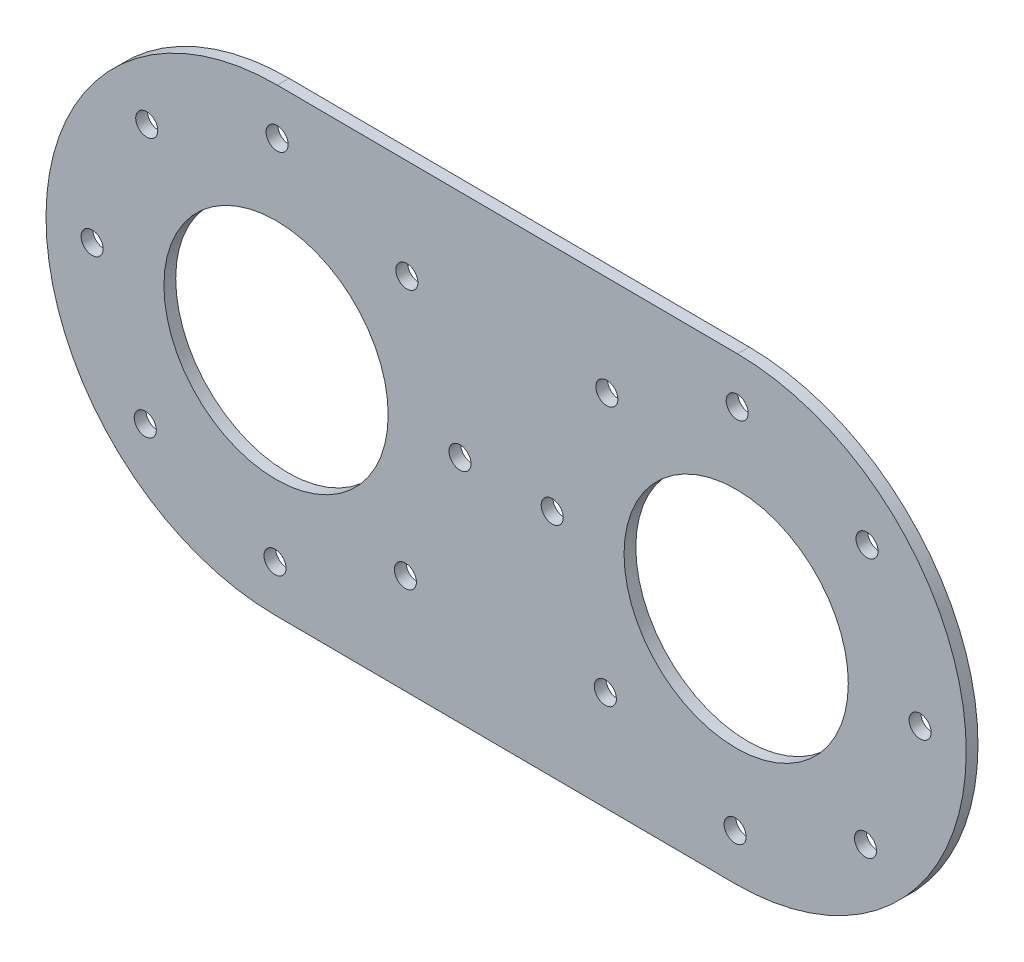
ISO-10303-21;
HEADER;
FILE_DESCRIPTION(('STEP AP214'),'2;1');
FILE_NAME('part.step','',(''),(''),'','','');
FILE_SCHEMA(('AUTOMOTIVE_DESIGN { 1 0 10303 214 1 1 1 1 }'));
ENDSEC;
DATA;
#1=APPLICATION_CONTEXT('core data for automotive mechanical design processes');
#2=APPLICATION_PROTOCOL_DEFINITION('international standard','automotive_design',2000,#1);
#3=PRODUCT_CONTEXT('',#1,'mechanical');
#4=PRODUCT('Part','Part','',(#3));
#5=PRODUCT_RELATED_PRODUCT_CATEGORY('part','',(#4));
#6=PRODUCT_DEFINITION_FORMATION('','',#4);
#7=PRODUCT_DEFINITION_CONTEXT('part definition',#1,'design');
#8=PRODUCT_DEFINITION('design','',#6,#7);
#9=PRODUCT_DEFINITION_SHAPE('','',#8);
#10=(LENGTH_UNIT() NAMED_UNIT(*) SI_UNIT(.MILLI.,.METRE.));
#11=(NAMED_UNIT(*) PLANE_ANGLE_UNIT() SI_UNIT($,.RADIAN.));
#12=(NAMED_UNIT(*) SI_UNIT($,.STERADIAN.) SOLID_ANGLE_UNIT());
#13=UNCERTAINTY_MEASURE_WITH_UNIT(LENGTH_MEASURE(1.E-05),#10,'distance_accuracy_value','');
#14=(GEOMETRIC_REPRESENTATION_CONTEXT(3) GLOBAL_UNCERTAINTY_ASSIGNED_CONTEXT((#13)) GLOBAL_UNIT_ASSIGNED_CONTEXT((#10,
#11,#12)) REPRESENTATION_CONTEXT('',''));
#15=CARTESIAN_POINT('',(0.,0.,0.));
#16=DIRECTION('',(0.,0.,1.));
#17=DIRECTION('',(1.,0.,0.));
#18=AXIS2_PLACEMENT_3D('',#15,#16,#17);
#19=CARTESIAN_POINT('',(0.0687496875803491,12.1384849747998,0.8));
#20=DIRECTION('',(0.00566368744206134,0.999983961193658,0.));
#21=DIRECTION('',(-0.999983961193658,0.00566368744206134,0.));
#22=AXIS2_PLACEMENT_3D('',#19,#20,#21);
#23=PLANE('',#22);
#24=DIRECTION('',(0.999983961193658,-0.00566368744206134,0.));
#25=VECTOR('',#24,1.);
#26=CARTESIAN_POINT('',(0.0687496875803491,12.1384849747998,0.));
#27=LINE('',#26,#25);
#28=CARTESIAN_POINT('',(0.0885443903629552,12.1383728619921,0.));
#29=VERTEX_POINT('',#28);
#30=CARTESIAN_POINT('',(31.3554397078373,11.9612840993379,0.));
#31=VERTEX_POINT('',#30);
#32=EDGE_CURVE('E160',#29,#31,#27,.T.);
#33=ORIENTED_EDGE('',*,*,#32,.F.);
#34=DIRECTION('',(0.,0.,-1.));
#35=VECTOR('',#34,1.);
#36=CARTESIAN_POINT('',(0.0885443903629552,12.1383728619921,0.8));
#37=LINE('',#36,#35);
#38=CARTESIAN_POINT('',(0.0885443903629552,12.1383728619921,0.8));
#39=VERTEX_POINT('',#38);
#40=EDGE_CURVE('E11',#39,#29,#37,.T.);
#41=ORIENTED_EDGE('',*,*,#40,.F.);
#42=DIRECTION('',(0.999983961193658,-0.00566368744206134,0.));
#43=VECTOR('',#42,1.);
#44=CARTESIAN_POINT('',(0.0687496875803491,12.1384849747998,0.8));
#45=LINE('',#44,#43);
#46=CARTESIAN_POINT('',(31.3554397078373,11.9612840993379,0.8));
#47=VERTEX_POINT('',#46);
#48=EDGE_CURVE('E94',#39,#47,#45,.T.);
#49=ORIENTED_EDGE('',*,*,#48,.T.);
#50=DIRECTION('',(0.,0.,-1.));
#51=VECTOR('',#50,1.);
#52=CARTESIAN_POINT('',(31.3554397078373,11.9612840993379,0.8));
#53=LINE('',#52,#51);
#54=EDGE_CURVE('E75',#47,#31,#53,.T.);
#55=ORIENTED_EDGE('',*,*,#54,.T.);
#56=EDGE_LOOP('',(#33,#41,#49,#55));
#57=FACE_BOUND('',#56,.T.);
#58=ADVANCED_FACE('F36',(#57),#23,.T.);
#59=CARTESIAN_POINT('',(0.,-3.4950763921212,0.8));
#60=DIRECTION('',(0.,0.,-1.));
#61=DIRECTION('',(-1.,0.,0.));
#62=AXIS2_PLACEMENT_3D('',#59,#60,#61);
#63=CYLINDRICAL_SURFACE('',#62,15.6337);
#64=CARTESIAN_POINT('',(0.,-3.4950763921212,0.));
#65=DIRECTION('',(0.,0.,1.));
#66=DIRECTION('',(1.,0.,0.));
#67=AXIS2_PLACEMENT_3D('',#64,#65,#66);
#68=CIRCLE('',#67,15.6337);
#69=CARTESIAN_POINT('',(-0.0885443903629465,-19.1285256462345,0.));
#70=VERTEX_POINT('',#69);
#71=EDGE_CURVE('E99',#29,#70,#68,.T.);
#72=ORIENTED_EDGE('',*,*,#71,.T.);
#73=DIRECTION('',(0.,0.,-1.));
#74=VECTOR('',#73,1.);
#75=CARTESIAN_POINT('',(-0.0885443903629465,-19.1285256462345,0.8));
#76=LINE('',#75,#74);
#77=CARTESIAN_POINT('',(-0.0885443903629465,-19.1285256462345,0.8));
#78=VERTEX_POINT('',#77);
#79=EDGE_CURVE('E45',#78,#70,#76,.T.);
#80=ORIENTED_EDGE('',*,*,#79,.F.);
#81=CARTESIAN_POINT('',(0.,-3.4950763921212,0.8));
#82=DIRECTION('',(0.,0.,1.));
#83=DIRECTION('',(1.,0.,0.));
#84=AXIS2_PLACEMENT_3D('',#81,#82,#83);
#85=CIRCLE('',#84,15.6337);
#86=EDGE_CURVE('E90',#39,#78,#85,.T.);
#87=ORIENTED_EDGE('',*,*,#86,.F.);
#88=ORIENTED_EDGE('',*,*,#40,.T.);
#89=EDGE_LOOP('',(#72,#80,#87,#88));
#90=FACE_BOUND('',#89,.T.);
#91=ADVANCED_FACE('F97',(#90),#63,.T.);
#92=CARTESIAN_POINT('',(-0.108339093145551,-19.1284135334268,0.8));
#93=DIRECTION('',(0.00566368744206089,0.999983961193658,0.));
#94=DIRECTION('',(-0.999983961193658,0.00566368744206089,0.));
#95=AXIS2_PLACEMENT_3D('',#92,#93,#94);
#96=PLANE('',#95);
#97=DIRECTION('',(0.999983961193658,-0.00566368744206089,0.));
#98=VECTOR('',#97,1.);
#99=CARTESIAN_POINT('',(-0.108339093145551,-19.1284135334268,0.));
#100=LINE('',#99,#98);
#101=CARTESIAN_POINT('',(31.1783509271114,-19.3056144088887,0.));
#102=VERTEX_POINT('',#101);
#103=EDGE_CURVE('E157',#70,#102,#100,.T.);
#104=ORIENTED_EDGE('',*,*,#103,.T.);
#105=DIRECTION('',(0.,0.,-1.));
#106=VECTOR('',#105,1.);
#107=CARTESIAN_POINT('',(31.1783509271114,-19.3056144088887,0.8));
#108=LINE('',#107,#106);
#109=CARTESIAN_POINT('',(31.1783509271114,-19.3056144088887,0.8));
#110=VERTEX_POINT('',#109);
#111=EDGE_CURVE('E89',#110,#102,#108,.T.);
#112=ORIENTED_EDGE('',*,*,#111,.F.);
#113=DIRECTION('',(0.999983961193658,-0.00566368744206089,0.));
#114=VECTOR('',#113,1.);
#115=CARTESIAN_POINT('',(-0.108339093145551,-19.1284135334268,0.8));
#116=LINE('',#115,#114);
#117=EDGE_CURVE('E83',#78,#110,#116,.T.);
#118=ORIENTED_EDGE('',*,*,#117,.F.);
#119=ORIENTED_EDGE('',*,*,#79,.T.);
#120=EDGE_LOOP('',(#104,#112,#118,#119));
#121=FACE_BOUND('',#120,.T.);
#122=ADVANCED_FACE('F86',(#121),#96,.F.);
#123=CARTESIAN_POINT('',(0.0707972285285009,9.00492360787915,0.8));
#124=DIRECTION('',(0.,0.,-1.));
#125=DIRECTION('',(-1.,0.,0.));
#126=AXIS2_PLACEMENT_3D('',#123,#124,#125);
#127=CYLINDRICAL_SURFACE('',#126,0.75);
#128=CARTESIAN_POINT('',(0.0707972285285009,9.00492360787915,0.8));
#129=DIRECTION('',(0.,0.,1.));
#130=DIRECTION('',(1.,0.,0.));
#131=AXIS2_PLACEMENT_3D('',#128,#129,#130);
#132=CIRCLE('',#131,0.75);
#133=CARTESIAN_POINT('',(0.820797228528501,9.00492360787915,0.8));
#134=VERTEX_POINT('',#133);
#135=EDGE_CURVE('E167',#134,#134,#132,.T.);
#136=ORIENTED_EDGE('',*,*,#135,.T.);
#137=EDGE_LOOP('',(#136));
#138=FACE_BOUND('',#137,.T.);
#139=CARTESIAN_POINT('',(0.0707972285285009,9.00492360787915,0.));
#140=DIRECTION('',(0.,0.,1.));
#141=DIRECTION('',(1.,0.,0.));
#142=AXIS2_PLACEMENT_3D('',#139,#140,#141);
#143=CIRCLE('',#142,0.75);
#144=CARTESIAN_POINT('',(0.820797228528501,9.00492360787915,0.));
#145=VERTEX_POINT('',#144);
#146=EDGE_CURVE('E108',#145,#145,#143,.T.);
#147=ORIENTED_EDGE('',*,*,#146,.F.);
#148=EDGE_LOOP('',(#147));
#149=FACE_BOUND('',#148,.T.);
#150=ADVANCED_FACE('F242',(#138,#149),#127,.F.);
#151=CARTESIAN_POINT('',(8.88889596521358,5.29369717232926,0.8));
#152=DIRECTION('',(0.,0.,-1.));
#153=DIRECTION('',(-1.,0.,0.));
#154=AXIS2_PLACEMENT_3D('',#151,#152,#153);
#155=CYLINDRICAL_SURFACE('',#154,0.75);
#156=CARTESIAN_POINT('',(8.88889596521358,5.29369717232926,0.8));
#157=DIRECTION('',(0.,0.,1.));
#158=DIRECTION('',(1.,0.,0.));
#159=AXIS2_PLACEMENT_3D('',#156,#157,#158);
#160=CIRCLE('',#159,0.75);
#161=CARTESIAN_POINT('',(9.63889596521358,5.29369717232926,0.8));
#162=VERTEX_POINT('',#161);
#163=EDGE_CURVE('E170',#162,#162,#160,.T.);
#164=ORIENTED_EDGE('',*,*,#163,.T.);
#165=EDGE_LOOP('',(#164));
#166=FACE_BOUND('',#165,.T.);
#167=CARTESIAN_POINT('',(8.88889596521358,5.29369717232926,0.));
#168=DIRECTION('',(0.,0.,1.));
#169=DIRECTION('',(1.,0.,0.));
#170=AXIS2_PLACEMENT_3D('',#167,#168,#169);
#171=CIRCLE('',#170,0.75);
#172=CARTESIAN_POINT('',(9.63889596521358,5.29369717232926,0.));
#173=VERTEX_POINT('',#172);
#174=EDGE_CURVE('E111',#173,#173,#171,.T.);
#175=ORIENTED_EDGE('',*,*,#174,.F.);
#176=EDGE_LOOP('',(#175));
#177=FACE_BOUND('',#176,.T.);
#178=ADVANCED_FACE('F302',(#166,#177),#155,.F.);
#179=CARTESIAN_POINT('',(8.78877356445009,-12.3839723573345,0.8));
#180=DIRECTION('',(0.,0.,-1.));
#181=DIRECTION('',(-1.,0.,0.));
#182=AXIS2_PLACEMENT_3D('',#179,#180,#181);
#183=CYLINDRICAL_SURFACE('',#182,0.75);
#184=CARTESIAN_POINT('',(8.78877356445009,-12.3839723573345,0.8));
#185=DIRECTION('',(0.,0.,1.));
#186=DIRECTION('',(1.,0.,0.));
#187=AXIS2_PLACEMENT_3D('',#184,#185,#186);
#188=CIRCLE('',#187,0.75);
#189=CARTESIAN_POINT('',(9.53877356445009,-12.3839723573345,0.8));
#190=VERTEX_POINT('',#189);
#191=EDGE_CURVE('E173',#190,#190,#188,.T.);
#192=ORIENTED_EDGE('',*,*,#191,.T.);
#193=EDGE_LOOP('',(#192));
#194=FACE_BOUND('',#193,.T.);
#195=CARTESIAN_POINT('',(8.78877356445009,-12.3839723573345,0.));
#196=DIRECTION('',(0.,0.,1.));
#197=DIRECTION('',(1.,0.,0.));
#198=AXIS2_PLACEMENT_3D('',#195,#196,#197);
#199=CIRCLE('',#198,0.75);
#200=CARTESIAN_POINT('',(9.53877356445009,-12.3839723573345,0.));
#201=VERTEX_POINT('',#200);
#202=EDGE_CURVE('E114',#201,#201,#199,.T.);
#203=ORIENTED_EDGE('',*,*,#202,.F.);
#204=EDGE_LOOP('',(#203));
#205=FACE_BOUND('',#204,.T.);
#206=ADVANCED_FACE('F298',(#194,#205),#183,.F.);
#207=CARTESIAN_POINT('',(-0.0707972285285828,-15.9950763921209,0.8));
#208=DIRECTION('',(0.,0.,-1.));
#209=DIRECTION('',(-1.,0.,0.));
#210=AXIS2_PLACEMENT_3D('',#207,#208,#209);
#211=CYLINDRICAL_SURFACE('',#210,0.75);
#212=CARTESIAN_POINT('',(-0.0707972285285828,-15.9950763921209,0.8));
#213=DIRECTION('',(0.,0.,1.));
#214=DIRECTION('',(1.,0.,0.));
#215=AXIS2_PLACEMENT_3D('',#212,#213,#214);
#216=CIRCLE('',#215,0.75);
#217=CARTESIAN_POINT('',(0.679202771471417,-15.9950763921209,0.8));
#218=VERTEX_POINT('',#217);
#219=EDGE_CURVE('E176',#218,#218,#216,.T.);
#220=ORIENTED_EDGE('',*,*,#219,.T.);
#221=EDGE_LOOP('',(#220));
#222=FACE_BOUND('',#221,.T.);
#223=CARTESIAN_POINT('',(-0.0707972285285828,-15.9950763921209,0.));
#224=DIRECTION('',(0.,0.,1.));
#225=DIRECTION('',(1.,0.,0.));
#226=AXIS2_PLACEMENT_3D('',#223,#224,#225);
#227=CIRCLE('',#226,0.75);
#228=CARTESIAN_POINT('',(0.679202771471417,-15.9950763921209,0.));
#229=VERTEX_POINT('',#228);
#230=EDGE_CURVE('E117',#229,#229,#227,.T.);
#231=ORIENTED_EDGE('',*,*,#230,.F.);
#232=EDGE_LOOP('',(#231));
#233=FACE_BOUND('',#232,.T.);
#234=ADVANCED_FACE('F294',(#222,#233),#211,.F.);
#235=CARTESIAN_POINT('',(-8.88889596521363,-12.2838499565709,0.8));
#236=DIRECTION('',(0.,0.,-1.));
#237=DIRECTION('',(-1.,0.,0.));
#238=AXIS2_PLACEMENT_3D('',#235,#236,#237);
#239=CYLINDRICAL_SURFACE('',#238,0.75);
#240=CARTESIAN_POINT('',(-8.88889596521363,-12.2838499565709,0.8));
#241=DIRECTION('',(0.,0.,1.));
#242=DIRECTION('',(1.,0.,0.));
#243=AXIS2_PLACEMENT_3D('',#240,#241,#242);
#244=CIRCLE('',#243,0.75);
#245=CARTESIAN_POINT('',(-8.13889596521363,-12.2838499565709,0.8));
#246=VERTEX_POINT('',#245);
#247=EDGE_CURVE('E179',#246,#246,#244,.T.);
#248=ORIENTED_EDGE('',*,*,#247,.T.);
#249=EDGE_LOOP('',(#248));
#250=FACE_BOUND('',#249,.T.);
#251=CARTESIAN_POINT('',(-8.88889596521363,-12.2838499565709,0.));
#252=DIRECTION('',(0.,0.,1.));
#253=DIRECTION('',(1.,0.,0.));
#254=AXIS2_PLACEMENT_3D('',#251,#252,#253);
#255=CIRCLE('',#254,0.75);
#256=CARTESIAN_POINT('',(-8.13889596521363,-12.2838499565709,0.));
#257=VERTEX_POINT('',#256);
#258=EDGE_CURVE('E120',#257,#257,#255,.T.);
#259=ORIENTED_EDGE('',*,*,#258,.F.);
#260=EDGE_LOOP('',(#259));
#261=FACE_BOUND('',#260,.T.);
#262=ADVANCED_FACE('F290',(#250,#261),#239,.F.);
#263=CARTESIAN_POINT('',(22.4781217530245,5.21673081043846,0.8));
#264=DIRECTION('',(0.,0.,-1.));
#265=DIRECTION('',(-1.,0.,0.));
#266=AXIS2_PLACEMENT_3D('',#263,#264,#265);
#267=CYLINDRICAL_SURFACE('',#266,0.749999999999998);
#268=CARTESIAN_POINT('',(22.4781217530245,5.21673081043846,0.8));
#269=DIRECTION('',(0.,0.,1.));
#270=DIRECTION('',(1.,0.,0.));
#271=AXIS2_PLACEMENT_3D('',#268,#269,#270);
#272=CIRCLE('',#271,0.749999999999998);
#273=CARTESIAN_POINT('',(23.2281217530245,5.21673081043846,0.8));
#274=VERTEX_POINT('',#273);
#275=EDGE_CURVE('E182',#274,#274,#272,.T.);
#276=ORIENTED_EDGE('',*,*,#275,.T.);
#277=EDGE_LOOP('',(#276));
#278=FACE_BOUND('',#277,.T.);
#279=CARTESIAN_POINT('',(22.4781217530245,5.21673081043846,0.));
#280=DIRECTION('',(0.,0.,1.));
#281=DIRECTION('',(1.,0.,0.));
#282=AXIS2_PLACEMENT_3D('',#279,#280,#281);
#283=CIRCLE('',#282,0.749999999999998);
#284=CARTESIAN_POINT('',(23.2281217530245,5.21673081043846,0.));
#285=VERTEX_POINT('',#284);
#286=EDGE_CURVE('E123',#285,#285,#283,.T.);
#287=ORIENTED_EDGE('',*,*,#286,.F.);
#288=EDGE_LOOP('',(#287));
#289=FACE_BOUND('',#288,.T.);
#290=ADVANCED_FACE('F286',(#278,#289),#267,.F.);
#291=CARTESIAN_POINT('',(31.3376925460033,8.82783484522462,0.8));
#292=DIRECTION('',(0.,0.,-1.));
#293=DIRECTION('',(-1.,0.,0.));
#294=AXIS2_PLACEMENT_3D('',#291,#292,#293);
#295=CYLINDRICAL_SURFACE('',#294,0.750000000000002);
#296=CARTESIAN_POINT('',(31.3376925460033,8.82783484522462,0.8));
#297=DIRECTION('',(0.,0.,1.));
#298=DIRECTION('',(1.,0.,0.));
#299=AXIS2_PLACEMENT_3D('',#296,#297,#298);
#300=CIRCLE('',#299,0.750000000000002);
#301=CARTESIAN_POINT('',(32.0876925460033,8.82783484522462,0.8));
#302=VERTEX_POINT('',#301);
#303=EDGE_CURVE('E185',#302,#302,#300,.T.);
#304=ORIENTED_EDGE('',*,*,#303,.T.);
#305=EDGE_LOOP('',(#304));
#306=FACE_BOUND('',#305,.T.);
#307=CARTESIAN_POINT('',(31.3376925460033,8.82783484522462,0.));
#308=DIRECTION('',(0.,0.,1.));
#309=DIRECTION('',(1.,0.,0.));
#310=AXIS2_PLACEMENT_3D('',#307,#308,#309);
#311=CIRCLE('',#310,0.750000000000002);
#312=CARTESIAN_POINT('',(32.0876925460033,8.82783484522462,0.));
#313=VERTEX_POINT('',#312);
#314=EDGE_CURVE('E126',#313,#313,#311,.T.);
#315=ORIENTED_EDGE('',*,*,#314,.F.);
#316=EDGE_LOOP('',(#315));
#317=FACE_BOUND('',#316,.T.);
#318=ADVANCED_FACE('F282',(#306,#317),#295,.F.);
#319=CARTESIAN_POINT('',(40.1557912826883,5.11660840967442,0.8));
#320=DIRECTION('',(0.,0.,-1.));
#321=DIRECTION('',(-1.,0.,0.));
#322=AXIS2_PLACEMENT_3D('',#319,#320,#321);
#323=CYLINDRICAL_SURFACE('',#322,0.749999999999998);
#324=CARTESIAN_POINT('',(40.1557912826883,5.11660840967442,0.8));
#325=DIRECTION('',(0.,0.,1.));
#326=DIRECTION('',(1.,0.,0.));
#327=AXIS2_PLACEMENT_3D('',#324,#325,#326);
#328=CIRCLE('',#327,0.749999999999998);
#329=CARTESIAN_POINT('',(40.9057912826883,5.11660840967442,0.8));
#330=VERTEX_POINT('',#329);
#331=EDGE_CURVE('E188',#330,#330,#328,.T.);
#332=ORIENTED_EDGE('',*,*,#331,.T.);
#333=EDGE_LOOP('',(#332));
#334=FACE_BOUND('',#333,.T.);
#335=CARTESIAN_POINT('',(40.1557912826883,5.11660840967442,0.));
#336=DIRECTION('',(0.,0.,1.));
#337=DIRECTION('',(1.,0.,0.));
#338=AXIS2_PLACEMENT_3D('',#335,#336,#337);
#339=CIRCLE('',#338,0.749999999999998);
#340=CARTESIAN_POINT('',(40.9057912826883,5.11660840967442,0.));
#341=VERTEX_POINT('',#340);
#342=EDGE_CURVE('E129',#341,#341,#339,.T.);
#343=ORIENTED_EDGE('',*,*,#342,.F.);
#344=EDGE_LOOP('',(#343));
#345=FACE_BOUND('',#344,.T.);
#346=ADVANCED_FACE('F278',(#334,#345),#323,.F.);
#347=CARTESIAN_POINT('',(40.0556688819243,-12.5610611199892,0.8));
#348=DIRECTION('',(0.,0.,-1.));
#349=DIRECTION('',(-1.,0.,0.));
#350=AXIS2_PLACEMENT_3D('',#347,#348,#349);
#351=CYLINDRICAL_SURFACE('',#350,0.749999999999995);
#352=CARTESIAN_POINT('',(40.0556688819243,-12.5610611199892,0.8));
#353=DIRECTION('',(0.,0.,1.));
#354=DIRECTION('',(1.,0.,0.));
#355=AXIS2_PLACEMENT_3D('',#352,#353,#354);
#356=CIRCLE('',#355,0.749999999999995);
#357=CARTESIAN_POINT('',(40.8056688819243,-12.5610611199892,0.8));
#358=VERTEX_POINT('',#357);
#359=EDGE_CURVE('E191',#358,#358,#356,.T.);
#360=ORIENTED_EDGE('',*,*,#359,.T.);
#361=EDGE_LOOP('',(#360));
#362=FACE_BOUND('',#361,.T.);
#363=CARTESIAN_POINT('',(40.0556688819243,-12.5610611199892,0.));
#364=DIRECTION('',(0.,0.,1.));
#365=DIRECTION('',(1.,0.,0.));
#366=AXIS2_PLACEMENT_3D('',#363,#364,#365);
#367=CIRCLE('',#366,0.749999999999995);
#368=CARTESIAN_POINT('',(40.8056688819243,-12.5610611199892,0.));
#369=VERTEX_POINT('',#368);
#370=EDGE_CURVE('E132',#369,#369,#367,.T.);
#371=ORIENTED_EDGE('',*,*,#370,.F.);
#372=EDGE_LOOP('',(#371));
#373=FACE_BOUND('',#372,.T.);
#374=ADVANCED_FACE('F274',(#362,#373),#351,.F.);
#375=CARTESIAN_POINT('',(31.1960980889455,-16.1721651547754,0.8));
#376=DIRECTION('',(0.,0.,-1.));
#377=DIRECTION('',(-1.,0.,0.));
#378=AXIS2_PLACEMENT_3D('',#375,#376,#377);
#379=CYLINDRICAL_SURFACE('',#378,0.749999999999997);
#380=CARTESIAN_POINT('',(31.1960980889455,-16.1721651547754,0.8));
#381=DIRECTION('',(0.,0.,1.));
#382=DIRECTION('',(1.,0.,0.));
#383=AXIS2_PLACEMENT_3D('',#380,#381,#382);
#384=CIRCLE('',#383,0.749999999999997);
#385=CARTESIAN_POINT('',(31.9460980889455,-16.1721651547754,0.8));
#386=VERTEX_POINT('',#385);
#387=EDGE_CURVE('E194',#386,#386,#384,.T.);
#388=ORIENTED_EDGE('',*,*,#387,.T.);
#389=EDGE_LOOP('',(#388));
#390=FACE_BOUND('',#389,.T.);
#391=CARTESIAN_POINT('',(31.1960980889455,-16.1721651547754,0.));
#392=DIRECTION('',(0.,0.,1.));
#393=DIRECTION('',(1.,0.,0.));
#394=AXIS2_PLACEMENT_3D('',#391,#392,#393);
#395=CIRCLE('',#394,0.749999999999997);
#396=CARTESIAN_POINT('',(31.9460980889455,-16.1721651547754,0.));
#397=VERTEX_POINT('',#396);
#398=EDGE_CURVE('E135',#397,#397,#395,.T.);
#399=ORIENTED_EDGE('',*,*,#398,.F.);
#400=EDGE_LOOP('',(#399));
#401=FACE_BOUND('',#400,.T.);
#402=ADVANCED_FACE('F270',(#390,#401),#379,.F.);
#403=CARTESIAN_POINT('',(22.3779993522605,-12.4609387192253,0.8));
#404=DIRECTION('',(0.,0.,-1.));
#405=DIRECTION('',(-1.,0.,0.));
#406=AXIS2_PLACEMENT_3D('',#403,#404,#405);
#407=CYLINDRICAL_SURFACE('',#406,0.749999999999998);
#408=CARTESIAN_POINT('',(22.3779993522605,-12.4609387192253,0.8));
#409=DIRECTION('',(0.,0.,1.));
#410=DIRECTION('',(1.,0.,0.));
#411=AXIS2_PLACEMENT_3D('',#408,#409,#410);
#412=CIRCLE('',#411,0.749999999999998);
#413=CARTESIAN_POINT('',(23.1279993522605,-12.4609387192253,0.8));
#414=VERTEX_POINT('',#413);
#415=EDGE_CURVE('E197',#414,#414,#412,.T.);
#416=ORIENTED_EDGE('',*,*,#415,.T.);
#417=EDGE_LOOP('',(#416));
#418=FACE_BOUND('',#417,.T.);
#419=CARTESIAN_POINT('',(22.3779993522605,-12.4609387192253,0.));
#420=DIRECTION('',(0.,0.,1.));
#421=DIRECTION('',(1.,0.,0.));
#422=AXIS2_PLACEMENT_3D('',#419,#420,#421);
#423=CIRCLE('',#422,0.749999999999998);
#424=CARTESIAN_POINT('',(23.1279993522605,-12.4609387192253,0.));
#425=VERTEX_POINT('',#424);
#426=EDGE_CURVE('E138',#425,#425,#423,.T.);
#427=ORIENTED_EDGE('',*,*,#426,.F.);
#428=EDGE_LOOP('',(#427));
#429=FACE_BOUND('',#428,.T.);
#430=ADVANCED_FACE('F266',(#418,#429),#407,.F.);
#431=CARTESIAN_POINT('',(31.2668953174744,-3.67216515477539,0.8));
#432=DIRECTION('',(0.,0.,-1.));
#433=DIRECTION('',(-1.,0.,0.));
#434=AXIS2_PLACEMENT_3D('',#431,#432,#433);
#435=CYLINDRICAL_SURFACE('',#434,7.61999999999999);
#436=CARTESIAN_POINT('',(31.2668953174744,-3.67216515477539,0.8));
#437=DIRECTION('',(0.,0.,1.));
#438=DIRECTION('',(1.,0.,0.));
#439=AXIS2_PLACEMENT_3D('',#436,#437,#438);
#440=CIRCLE('',#439,7.61999999999999);
#441=CARTESIAN_POINT('',(38.8868953174744,-3.67216515477539,0.8));
#442=VERTEX_POINT('',#441);
#443=EDGE_CURVE('E200',#442,#442,#440,.T.);
#444=ORIENTED_EDGE('',*,*,#443,.T.);
#445=EDGE_LOOP('',(#444));
#446=FACE_BOUND('',#445,.T.);
#447=CARTESIAN_POINT('',(31.2668953174744,-3.67216515477539,0.));
#448=DIRECTION('',(0.,0.,1.));
#449=DIRECTION('',(1.,0.,0.));
#450=AXIS2_PLACEMENT_3D('',#447,#448,#449);
#451=CIRCLE('',#450,7.61999999999999);
#452=CARTESIAN_POINT('',(38.8868953174744,-3.67216515477539,0.));
#453=VERTEX_POINT('',#452);
#454=EDGE_CURVE('E141',#453,#453,#451,.T.);
#455=ORIENTED_EDGE('',*,*,#454,.F.);
#456=EDGE_LOOP('',(#455));
#457=FACE_BOUND('',#456,.T.);
#458=ADVANCED_FACE('F262',(#446,#457),#435,.F.);
#459=CARTESIAN_POINT('',(43.7668953174744,-3.74296238330419,0.8));
#460=DIRECTION('',(0.,0.,-1.));
#461=DIRECTION('',(-1.,0.,0.));
#462=AXIS2_PLACEMENT_3D('',#459,#460,#461);
#463=CYLINDRICAL_SURFACE('',#462,0.749999999999999);
#464=CARTESIAN_POINT('',(43.7668953174744,-3.74296238330419,0.8));
#465=DIRECTION('',(0.,0.,1.));
#466=DIRECTION('',(1.,0.,0.));
#467=AXIS2_PLACEMENT_3D('',#464,#465,#466);
#468=CIRCLE('',#467,0.749999999999999);
#469=CARTESIAN_POINT('',(44.5168953174744,-3.74296238330419,0.8));
#470=VERTEX_POINT('',#469);
#471=EDGE_CURVE('E203',#470,#470,#468,.T.);
#472=ORIENTED_EDGE('',*,*,#471,.T.);
#473=EDGE_LOOP('',(#472));
#474=FACE_BOUND('',#473,.T.);
#475=CARTESIAN_POINT('',(43.7668953174744,-3.74296238330419,0.));
#476=DIRECTION('',(0.,0.,1.));
#477=DIRECTION('',(1.,0.,0.));
#478=AXIS2_PLACEMENT_3D('',#475,#476,#477);
#479=CIRCLE('',#478,0.749999999999999);
#480=CARTESIAN_POINT('',(44.5168953174744,-3.74296238330419,0.));
#481=VERTEX_POINT('',#480);
#482=EDGE_CURVE('E144',#481,#481,#479,.T.);
#483=ORIENTED_EDGE('',*,*,#482,.F.);
#484=EDGE_LOOP('',(#483));
#485=FACE_BOUND('',#484,.T.);
#486=ADVANCED_FACE('F258',(#474,#485),#463,.F.);
#487=CARTESIAN_POINT('',(18.7668953174744,-3.6013679262465,0.8));
#488=DIRECTION('',(0.,0.,-1.));
#489=DIRECTION('',(-1.,0.,0.));
#490=AXIS2_PLACEMENT_3D('',#487,#488,#489);
#491=CYLINDRICAL_SURFACE('',#490,0.749999999999997);
#492=CARTESIAN_POINT('',(18.7668953174744,-3.6013679262465,0.8));
#493=DIRECTION('',(0.,0.,1.));
#494=DIRECTION('',(1.,0.,0.));
#495=AXIS2_PLACEMENT_3D('',#492,#493,#494);
#496=CIRCLE('',#495,0.749999999999997);
#497=CARTESIAN_POINT('',(19.5168953174744,-3.6013679262465,0.8));
#498=VERTEX_POINT('',#497);
#499=EDGE_CURVE('E206',#498,#498,#496,.T.);
#500=ORIENTED_EDGE('',*,*,#499,.T.);
#501=EDGE_LOOP('',(#500));
#502=FACE_BOUND('',#501,.T.);
#503=CARTESIAN_POINT('',(18.7668953174744,-3.6013679262465,0.));
#504=DIRECTION('',(0.,0.,1.));
#505=DIRECTION('',(1.,0.,0.));
#506=AXIS2_PLACEMENT_3D('',#503,#504,#505);
#507=CIRCLE('',#506,0.749999999999997);
#508=CARTESIAN_POINT('',(19.5168953174744,-3.6013679262465,0.));
#509=VERTEX_POINT('',#508);
#510=EDGE_CURVE('E147',#509,#509,#507,.T.);
#511=ORIENTED_EDGE('',*,*,#510,.F.);
#512=EDGE_LOOP('',(#511));
#513=FACE_BOUND('',#512,.T.);
#514=ADVANCED_FACE('F254',(#502,#513),#491,.F.);
#515=CARTESIAN_POINT('',(0.,-3.4950763921212,0.8));
#516=DIRECTION('',(0.,0.,-1.));
#517=DIRECTION('',(-1.,0.,0.));
#518=AXIS2_PLACEMENT_3D('',#515,#516,#517);
#519=CYLINDRICAL_SURFACE('',#518,7.62);
#520=CARTESIAN_POINT('',(0.,-3.4950763921212,0.8));
#521=DIRECTION('',(0.,0.,1.));
#522=DIRECTION('',(1.,0.,0.));
#523=AXIS2_PLACEMENT_3D('',#520,#521,#522);
#524=CIRCLE('',#523,7.62);
#525=CARTESIAN_POINT('',(7.62,-3.4950763921212,0.8));
#526=VERTEX_POINT('',#525);
#527=EDGE_CURVE('E209',#526,#526,#524,.T.);
#528=ORIENTED_EDGE('',*,*,#527,.T.);
#529=EDGE_LOOP('',(#528));
#530=FACE_BOUND('',#529,.T.);
#531=CARTESIAN_POINT('',(0.,-3.4950763921212,0.));
#532=DIRECTION('',(0.,0.,1.));
#533=DIRECTION('',(1.,0.,0.));
#534=AXIS2_PLACEMENT_3D('',#531,#532,#533);
#535=CIRCLE('',#534,7.62);
#536=CARTESIAN_POINT('',(7.62,-3.4950763921212,0.));
#537=VERTEX_POINT('',#536);
#538=EDGE_CURVE('E150',#537,#537,#535,.T.);
#539=ORIENTED_EDGE('',*,*,#538,.F.);
#540=EDGE_LOOP('',(#539));
#541=FACE_BOUND('',#540,.T.);
#542=ADVANCED_FACE('F250',(#530,#541),#519,.F.);
#543=CARTESIAN_POINT('',(12.5,-3.56587362064939,0.8));
#544=DIRECTION('',(0.,0.,-1.));
#545=DIRECTION('',(-1.,0.,0.));
#546=AXIS2_PLACEMENT_3D('',#543,#544,#545);
#547=CYLINDRICAL_SURFACE('',#546,0.75);
#548=CARTESIAN_POINT('',(12.5,-3.56587362064939,0.8));
#549=DIRECTION('',(0.,0.,1.));
#550=DIRECTION('',(1.,0.,0.));
#551=AXIS2_PLACEMENT_3D('',#548,#549,#550);
#552=CIRCLE('',#551,0.75);
#553=CARTESIAN_POINT('',(13.25,-3.56587362064939,0.8));
#554=VERTEX_POINT('',#553);
#555=EDGE_CURVE('E212',#554,#554,#552,.T.);
#556=ORIENTED_EDGE('',*,*,#555,.T.);
#557=EDGE_LOOP('',(#556));
#558=FACE_BOUND('',#557,.T.);
#559=CARTESIAN_POINT('',(12.5,-3.56587362064939,0.));
#560=DIRECTION('',(0.,0.,1.));
#561=DIRECTION('',(1.,0.,0.));
#562=AXIS2_PLACEMENT_3D('',#559,#560,#561);
#563=CIRCLE('',#562,0.75);
#564=CARTESIAN_POINT('',(13.25,-3.56587362064939,0.));
#565=VERTEX_POINT('',#564);
#566=EDGE_CURVE('E153',#565,#565,#563,.T.);
#567=ORIENTED_EDGE('',*,*,#566,.F.);
#568=EDGE_LOOP('',(#567));
#569=FACE_BOUND('',#568,.T.);
#570=ADVANCED_FACE('F246',(#558,#569),#547,.F.);
#571=CARTESIAN_POINT('',(31.2668953174744,-3.67216515477539,0.8));
#572=DIRECTION('',(0.,0.,-1.));
#573=DIRECTION('',(-1.,0.,0.));
#574=AXIS2_PLACEMENT_3D('',#571,#572,#573);
#575=CYLINDRICAL_SURFACE('',#574,15.6337);
#576=CARTESIAN_POINT('',(31.2668953174744,-3.67216515477539,0.));
#577=DIRECTION('',(0.,0.,1.));
#578=DIRECTION('',(1.,0.,0.));
#579=AXIS2_PLACEMENT_3D('',#576,#577,#578);
#580=CIRCLE('',#579,15.6337);
#581=EDGE_CURVE('E68',#102,#31,#580,.T.);
#582=ORIENTED_EDGE('',*,*,#581,.T.);
#583=ORIENTED_EDGE('',*,*,#54,.F.);
#584=CARTESIAN_POINT('',(31.2668953174744,-3.67216515477539,0.8));
#585=DIRECTION('',(0.,0.,1.));
#586=DIRECTION('',(1.,0.,0.));
#587=AXIS2_PLACEMENT_3D('',#584,#585,#586);
#588=CIRCLE('',#587,15.6337);
#589=EDGE_CURVE('E53',#110,#47,#588,.T.);
#590=ORIENTED_EDGE('',*,*,#589,.F.);
#591=ORIENTED_EDGE('',*,*,#111,.T.);
#592=EDGE_LOOP('',(#582,#583,#590,#591));
#593=FACE_BOUND('',#592,.T.);
#594=ADVANCED_FACE('F243',(#593),#575,.T.);
#595=CARTESIAN_POINT('',(-12.5,-3.4242791635924,0.8));
#596=DIRECTION('',(0.,0.,-1.));
#597=DIRECTION('',(-1.,0.,0.));
#598=AXIS2_PLACEMENT_3D('',#595,#596,#597);
#599=CYLINDRICAL_SURFACE('',#598,0.75);
#600=CARTESIAN_POINT('',(-12.5,-3.4242791635924,0.8));
#601=DIRECTION('',(0.,0.,1.));
#602=DIRECTION('',(1.,0.,0.));
#603=AXIS2_PLACEMENT_3D('',#600,#601,#602);
#604=CIRCLE('',#603,0.75);
#605=CARTESIAN_POINT('',(-11.75,-3.4242791635924,0.8));
#606=VERTEX_POINT('',#605);
#607=EDGE_CURVE('E107',#606,#606,#604,.T.);
#608=ORIENTED_EDGE('',*,*,#607,.T.);
#609=EDGE_LOOP('',(#608));
#610=FACE_BOUND('',#609,.T.);
#611=CARTESIAN_POINT('',(-12.5,-3.4242791635924,0.));
#612=DIRECTION('',(0.,0.,1.));
#613=DIRECTION('',(1.,0.,0.));
#614=AXIS2_PLACEMENT_3D('',#611,#612,#613);
#615=CIRCLE('',#614,0.75);
#616=CARTESIAN_POINT('',(-11.75,-3.4242791635924,0.));
#617=VERTEX_POINT('',#616);
#618=EDGE_CURVE('E162',#617,#617,#615,.T.);
#619=ORIENTED_EDGE('',*,*,#618,.F.);
#620=EDGE_LOOP('',(#619));
#621=FACE_BOUND('',#620,.T.);
#622=ADVANCED_FACE('F38',(#610,#621),#599,.F.);
#623=CARTESIAN_POINT('',(-8.78877356445014,5.39381957309269,0.8));
#624=DIRECTION('',(0.,0.,-1.));
#625=DIRECTION('',(-1.,0.,0.));
#626=AXIS2_PLACEMENT_3D('',#623,#624,#625);
#627=CYLINDRICAL_SURFACE('',#626,0.75);
#628=CARTESIAN_POINT('',(-8.78877356445014,5.39381957309269,0.8));
#629=DIRECTION('',(0.,0.,1.));
#630=DIRECTION('',(1.,0.,0.));
#631=AXIS2_PLACEMENT_3D('',#628,#629,#630);
#632=CIRCLE('',#631,0.75);
#633=CARTESIAN_POINT('',(-8.03877356445014,5.39381957309269,0.8));
#634=VERTEX_POINT('',#633);
#635=EDGE_CURVE('E103',#634,#634,#632,.T.);
#636=ORIENTED_EDGE('',*,*,#635,.T.);
#637=EDGE_LOOP('',(#636));
#638=FACE_BOUND('',#637,.T.);
#639=CARTESIAN_POINT('',(-8.78877356445014,5.39381957309269,0.));
#640=DIRECTION('',(0.,0.,1.));
#641=DIRECTION('',(1.,0.,0.));
#642=AXIS2_PLACEMENT_3D('',#639,#640,#641);
#643=CIRCLE('',#642,0.75);
#644=CARTESIAN_POINT('',(-8.03877356445014,5.39381957309269,0.));
#645=VERTEX_POINT('',#644);
#646=EDGE_CURVE('E104',#645,#645,#643,.T.);
#647=ORIENTED_EDGE('',*,*,#646,.F.);
#648=EDGE_LOOP('',(#647));
#649=FACE_BOUND('',#648,.T.);
#650=ADVANCED_FACE('F224',(#638,#649),#627,.F.);
#651=CARTESIAN_POINT('',(0.,0.,0.8));
#652=DIRECTION('',(0.,0.,1.));
#653=DIRECTION('',(1.,0.,0.));
#654=AXIS2_PLACEMENT_3D('',#651,#652,#653);
#655=PLANE('',#654);
#656=ORIENTED_EDGE('',*,*,#607,.F.);
#657=EDGE_LOOP('',(#656));
#658=FACE_BOUND('',#657,.T.);
#659=ORIENTED_EDGE('',*,*,#48,.F.);
#660=ORIENTED_EDGE('',*,*,#86,.T.);
#661=ORIENTED_EDGE('',*,*,#117,.T.);
#662=ORIENTED_EDGE('',*,*,#589,.T.);
#663=EDGE_LOOP('',(#659,#660,#661,#662));
#664=FACE_BOUND('',#663,.T.);
#665=ORIENTED_EDGE('',*,*,#555,.F.);
#666=EDGE_LOOP('',(#665));
#667=FACE_BOUND('',#666,.T.);
#668=ORIENTED_EDGE('',*,*,#527,.F.);
#669=EDGE_LOOP('',(#668));
#670=FACE_BOUND('',#669,.T.);
#671=ORIENTED_EDGE('',*,*,#499,.F.);
#672=EDGE_LOOP('',(#671));
#673=FACE_BOUND('',#672,.T.);
#674=ORIENTED_EDGE('',*,*,#471,.F.);
#675=EDGE_LOOP('',(#674));
#676=FACE_BOUND('',#675,.T.);
#677=ORIENTED_EDGE('',*,*,#443,.F.);
#678=EDGE_LOOP('',(#677));
#679=FACE_BOUND('',#678,.T.);
#680=ORIENTED_EDGE('',*,*,#415,.F.);
#681=EDGE_LOOP('',(#680));
#682=FACE_BOUND('',#681,.T.);
#683=ORIENTED_EDGE('',*,*,#387,.F.);
#684=EDGE_LOOP('',(#683));
#685=FACE_BOUND('',#684,.T.);
#686=ORIENTED_EDGE('',*,*,#359,.F.);
#687=EDGE_LOOP('',(#686));
#688=FACE_BOUND('',#687,.T.);
#689=ORIENTED_EDGE('',*,*,#331,.F.);
#690=EDGE_LOOP('',(#689));
#691=FACE_BOUND('',#690,.T.);
#692=ORIENTED_EDGE('',*,*,#303,.F.);
#693=EDGE_LOOP('',(#692));
#694=FACE_BOUND('',#693,.T.);
#695=ORIENTED_EDGE('',*,*,#275,.F.);
#696=EDGE_LOOP('',(#695));
#697=FACE_BOUND('',#696,.T.);
#698=ORIENTED_EDGE('',*,*,#247,.F.);
#699=EDGE_LOOP('',(#698));
#700=FACE_BOUND('',#699,.T.);
#701=ORIENTED_EDGE('',*,*,#219,.F.);
#702=EDGE_LOOP('',(#701));
#703=FACE_BOUND('',#702,.T.);
#704=ORIENTED_EDGE('',*,*,#191,.F.);
#705=EDGE_LOOP('',(#704));
#706=FACE_BOUND('',#705,.T.);
#707=ORIENTED_EDGE('',*,*,#163,.F.);
#708=EDGE_LOOP('',(#707));
#709=FACE_BOUND('',#708,.T.);
#710=ORIENTED_EDGE('',*,*,#135,.F.);
#711=EDGE_LOOP('',(#710));
#712=FACE_BOUND('',#711,.T.);
#713=ORIENTED_EDGE('',*,*,#635,.F.);
#714=EDGE_LOOP('',(#713));
#715=FACE_BOUND('',#714,.T.);
#716=ADVANCED_FACE('F92',(#658,#664,#667,#670,#673,#676,#679,#682,#685,#688,#691,#694,#697,#700,
#703,#706,#709,#712,#715),#655,.T.);
#717=CARTESIAN_POINT('',(0.,0.,0.));
#718=DIRECTION('',(0.,0.,1.));
#719=DIRECTION('',(1.,0.,0.));
#720=AXIS2_PLACEMENT_3D('',#717,#718,#719);
#721=PLANE('',#720);
#722=ORIENTED_EDGE('',*,*,#618,.T.);
#723=EDGE_LOOP('',(#722));
#724=FACE_BOUND('',#723,.T.);
#725=ORIENTED_EDGE('',*,*,#32,.T.);
#726=ORIENTED_EDGE('',*,*,#581,.F.);
#727=ORIENTED_EDGE('',*,*,#103,.F.);
#728=ORIENTED_EDGE('',*,*,#71,.F.);
#729=EDGE_LOOP('',(#725,#726,#727,#728));
#730=FACE_BOUND('',#729,.T.);
#731=ORIENTED_EDGE('',*,*,#566,.T.);
#732=EDGE_LOOP('',(#731));
#733=FACE_BOUND('',#732,.T.);
#734=ORIENTED_EDGE('',*,*,#538,.T.);
#735=EDGE_LOOP('',(#734));
#736=FACE_BOUND('',#735,.T.);
#737=ORIENTED_EDGE('',*,*,#510,.T.);
#738=EDGE_LOOP('',(#737));
#739=FACE_BOUND('',#738,.T.);
#740=ORIENTED_EDGE('',*,*,#482,.T.);
#741=EDGE_LOOP('',(#740));
#742=FACE_BOUND('',#741,.T.);
#743=ORIENTED_EDGE('',*,*,#454,.T.);
#744=EDGE_LOOP('',(#743));
#745=FACE_BOUND('',#744,.T.);
#746=ORIENTED_EDGE('',*,*,#426,.T.);
#747=EDGE_LOOP('',(#746));
#748=FACE_BOUND('',#747,.T.);
#749=ORIENTED_EDGE('',*,*,#398,.T.);
#750=EDGE_LOOP('',(#749));
#751=FACE_BOUND('',#750,.T.);
#752=ORIENTED_EDGE('',*,*,#370,.T.);
#753=EDGE_LOOP('',(#752));
#754=FACE_BOUND('',#753,.T.);
#755=ORIENTED_EDGE('',*,*,#342,.T.);
#756=EDGE_LOOP('',(#755));
#757=FACE_BOUND('',#756,.T.);
#758=ORIENTED_EDGE('',*,*,#314,.T.);
#759=EDGE_LOOP('',(#758));
#760=FACE_BOUND('',#759,.T.);
#761=ORIENTED_EDGE('',*,*,#286,.T.);
#762=EDGE_LOOP('',(#761));
#763=FACE_BOUND('',#762,.T.);
#764=ORIENTED_EDGE('',*,*,#258,.T.);
#765=EDGE_LOOP('',(#764));
#766=FACE_BOUND('',#765,.T.);
#767=ORIENTED_EDGE('',*,*,#230,.T.);
#768=EDGE_LOOP('',(#767));
#769=FACE_BOUND('',#768,.T.);
#770=ORIENTED_EDGE('',*,*,#202,.T.);
#771=EDGE_LOOP('',(#770));
#772=FACE_BOUND('',#771,.T.);
#773=ORIENTED_EDGE('',*,*,#174,.T.);
#774=EDGE_LOOP('',(#773));
#775=FACE_BOUND('',#774,.T.);
#776=ORIENTED_EDGE('',*,*,#146,.T.);
#777=EDGE_LOOP('',(#776));
#778=FACE_BOUND('',#777,.T.);
#779=ORIENTED_EDGE('',*,*,#646,.T.);
#780=EDGE_LOOP('',(#779));
#781=FACE_BOUND('',#780,.T.);
#782=ADVANCED_FACE('F223',(#724,#730,#733,#736,#739,#742,#745,#748,#751,#754,#757,#760,#763,
#766,#769,#772,#775,#778,#781),#721,.F.);
#783=CLOSED_SHELL('',(#58,#91,#122,#150,#178,#206,#234,#262,#290,#318,#346,#374,#402,#430,#458,
#486,#514,#542,#570,#594,#622,#650,#716,#782));
#784=MANIFOLD_SOLID_BREP('B2',#783);
#785=ADVANCED_BREP_SHAPE_REPRESENTATION('',(#18,#784),#14);
#786=SHAPE_DEFINITION_REPRESENTATION(#9,#785);
ENDSEC;
END-ISO-10303-21;
